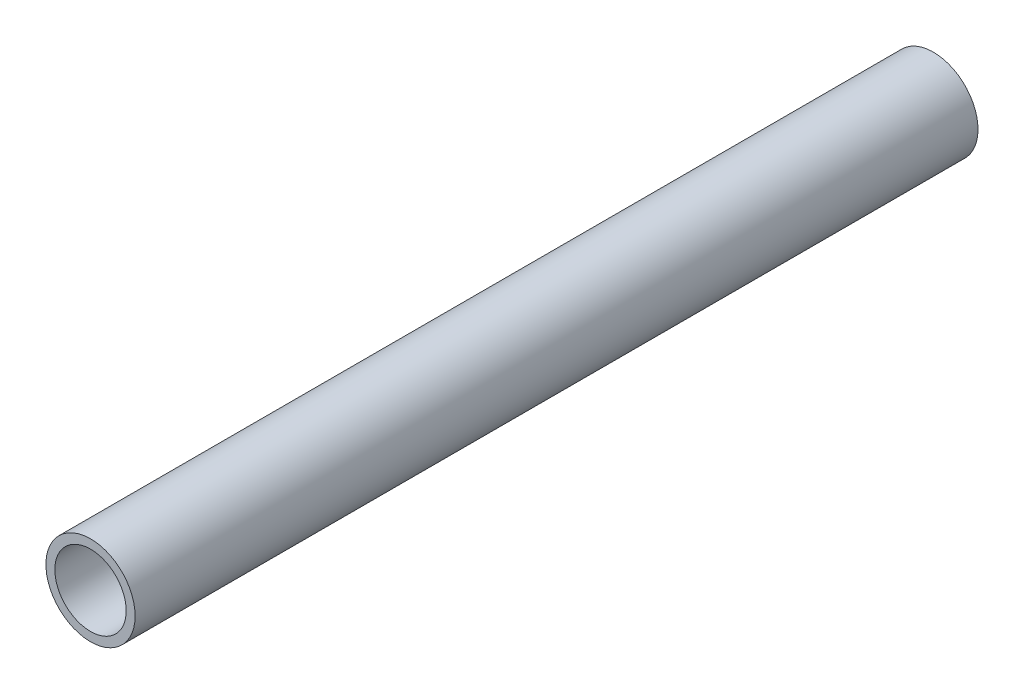
ISO-10303-21;
HEADER;
FILE_DESCRIPTION(('STEP AP214'),'2;1');
FILE_NAME('part.step','',(''),(''),'','','');
FILE_SCHEMA(('AUTOMOTIVE_DESIGN { 1 0 10303 214 1 1 1 1 }'));
ENDSEC;
DATA;
#1=APPLICATION_CONTEXT('core data for automotive mechanical design processes');
#2=APPLICATION_PROTOCOL_DEFINITION('international standard','automotive_design',2000,#1);
#3=PRODUCT_CONTEXT('',#1,'mechanical');
#4=PRODUCT('Part','Part','',(#3));
#5=PRODUCT_RELATED_PRODUCT_CATEGORY('part','',(#4));
#6=PRODUCT_DEFINITION_FORMATION('','',#4);
#7=PRODUCT_DEFINITION_CONTEXT('part definition',#1,'design');
#8=PRODUCT_DEFINITION('design','',#6,#7);
#9=PRODUCT_DEFINITION_SHAPE('','',#8);
#10=(LENGTH_UNIT() NAMED_UNIT(*) SI_UNIT(.MILLI.,.METRE.));
#11=(NAMED_UNIT(*) PLANE_ANGLE_UNIT() SI_UNIT($,.RADIAN.));
#12=(NAMED_UNIT(*) SI_UNIT($,.STERADIAN.) SOLID_ANGLE_UNIT());
#13=UNCERTAINTY_MEASURE_WITH_UNIT(LENGTH_MEASURE(1.E-05),#10,'distance_accuracy_value','');
#14=(GEOMETRIC_REPRESENTATION_CONTEXT(3) GLOBAL_UNCERTAINTY_ASSIGNED_CONTEXT((#13)) GLOBAL_UNIT_ASSIGNED_CONTEXT((#10,
#11,#12)) REPRESENTATION_CONTEXT('',''));
#15=CARTESIAN_POINT('',(0.,0.,0.));
#16=DIRECTION('',(0.,0.,1.));
#17=DIRECTION('',(1.,0.,0.));
#18=AXIS2_PLACEMENT_3D('',#15,#16,#17);
#19=CARTESIAN_POINT('',(0.,0.,189.));
#20=DIRECTION('',(0.,0.,1.));
#21=DIRECTION('',(1.,0.,0.));
#22=AXIS2_PLACEMENT_3D('',#19,#20,#21);
#23=PLANE('',#22);
#24=CARTESIAN_POINT('',(0.,0.,189.));
#25=DIRECTION('',(0.,0.,1.));
#26=DIRECTION('',(1.,0.,0.));
#27=AXIS2_PLACEMENT_3D('',#24,#25,#26);
#28=CIRCLE('',#27,10.);
#29=CARTESIAN_POINT('',(10.,0.,189.));
#30=VERTEX_POINT('',#29);
#31=EDGE_CURVE('E11',#30,#30,#28,.T.);
#32=ORIENTED_EDGE('',*,*,#31,.T.);
#33=EDGE_LOOP('',(#32));
#34=FACE_BOUND('',#33,.T.);
#35=CARTESIAN_POINT('',(0.,0.,189.));
#36=DIRECTION('',(0.,0.,1.));
#37=DIRECTION('',(1.,0.,0.));
#38=AXIS2_PLACEMENT_3D('',#35,#36,#37);
#39=CIRCLE('',#38,8.);
#40=CARTESIAN_POINT('',(8.,0.,189.));
#41=VERTEX_POINT('',#40);
#42=EDGE_CURVE('E56',#41,#41,#39,.T.);
#43=ORIENTED_EDGE('',*,*,#42,.F.);
#44=EDGE_LOOP('',(#43));
#45=FACE_BOUND('',#44,.T.);
#46=ADVANCED_FACE('F45',(#34,#45),#23,.T.);
#47=CARTESIAN_POINT('',(0.,0.,0.));
#48=DIRECTION('',(0.,0.,1.));
#49=DIRECTION('',(1.,0.,0.));
#50=AXIS2_PLACEMENT_3D('',#47,#48,#49);
#51=PLANE('',#50);
#52=CARTESIAN_POINT('',(0.,0.,0.));
#53=DIRECTION('',(0.,0.,1.));
#54=DIRECTION('',(1.,0.,0.));
#55=AXIS2_PLACEMENT_3D('',#52,#53,#54);
#56=CIRCLE('',#55,10.);
#57=CARTESIAN_POINT('',(10.,0.,0.));
#58=VERTEX_POINT('',#57);
#59=EDGE_CURVE('E52',#58,#58,#56,.T.);
#60=ORIENTED_EDGE('',*,*,#59,.F.);
#61=EDGE_LOOP('',(#60));
#62=FACE_BOUND('',#61,.T.);
#63=CARTESIAN_POINT('',(0.,0.,0.));
#64=DIRECTION('',(0.,0.,1.));
#65=DIRECTION('',(1.,0.,0.));
#66=AXIS2_PLACEMENT_3D('',#63,#64,#65);
#67=CIRCLE('',#66,8.);
#68=CARTESIAN_POINT('',(8.,0.,0.));
#69=VERTEX_POINT('',#68);
#70=EDGE_CURVE('E60',#69,#69,#67,.T.);
#71=ORIENTED_EDGE('',*,*,#70,.T.);
#72=EDGE_LOOP('',(#71));
#73=FACE_BOUND('',#72,.T.);
#74=ADVANCED_FACE('F66',(#62,#73),#51,.F.);
#75=CARTESIAN_POINT('',(0.,0.,189.));
#76=DIRECTION('',(0.,0.,-1.));
#77=DIRECTION('',(-1.,0.,0.));
#78=AXIS2_PLACEMENT_3D('',#75,#76,#77);
#79=CYLINDRICAL_SURFACE('',#78,10.);
#80=ORIENTED_EDGE('',*,*,#31,.F.);
#81=EDGE_LOOP('',(#80));
#82=FACE_BOUND('',#81,.T.);
#83=ORIENTED_EDGE('',*,*,#59,.T.);
#84=EDGE_LOOP('',(#83));
#85=FACE_BOUND('',#84,.T.);
#86=ADVANCED_FACE('F47',(#82,#85),#79,.T.);
#87=CARTESIAN_POINT('',(0.,0.,189.));
#88=DIRECTION('',(0.,0.,-1.));
#89=DIRECTION('',(-1.,0.,0.));
#90=AXIS2_PLACEMENT_3D('',#87,#88,#89);
#91=CYLINDRICAL_SURFACE('',#90,8.);
#92=ORIENTED_EDGE('',*,*,#42,.T.);
#93=EDGE_LOOP('',(#92));
#94=FACE_BOUND('',#93,.T.);
#95=ORIENTED_EDGE('',*,*,#70,.F.);
#96=EDGE_LOOP('',(#95));
#97=FACE_BOUND('',#96,.T.);
#98=ADVANCED_FACE('F68',(#94,#97),#91,.F.);
#99=CLOSED_SHELL('',(#46,#74,#86,#98));
#100=MANIFOLD_SOLID_BREP('B2',#99);
#101=ADVANCED_BREP_SHAPE_REPRESENTATION('',(#18,#100),#14);
#102=SHAPE_DEFINITION_REPRESENTATION(#9,#101);
ENDSEC;
END-ISO-10303-21;
